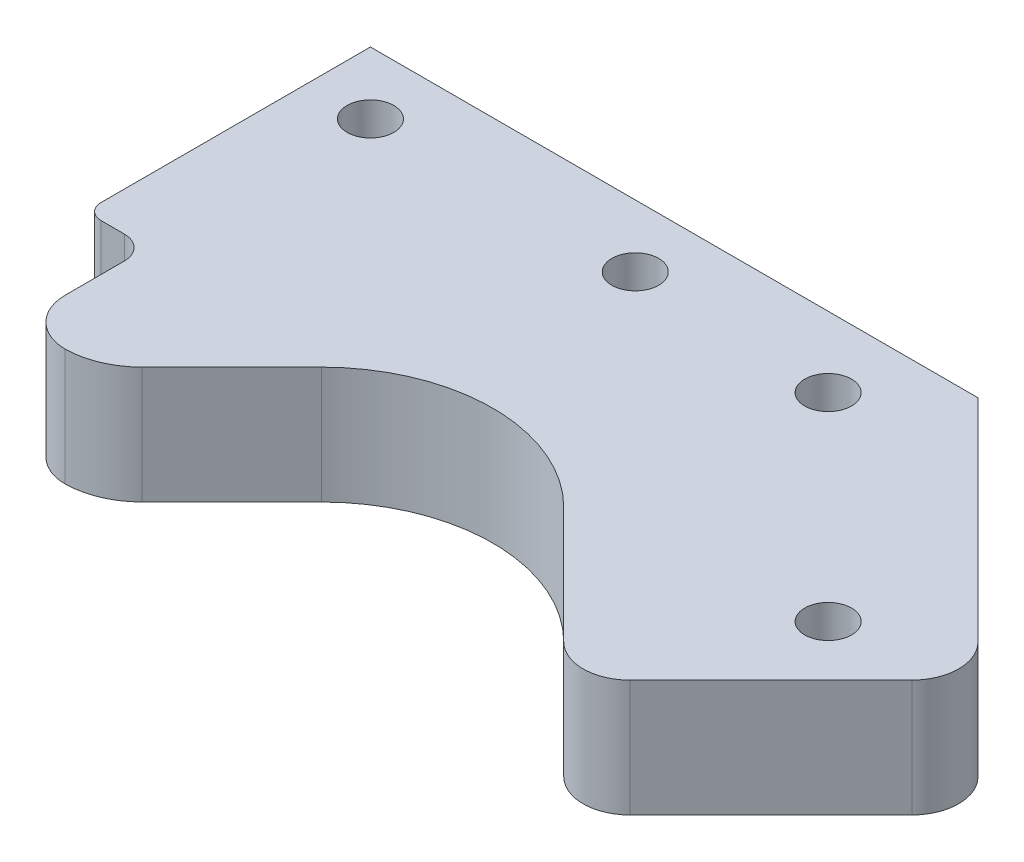
ISO-10303-21;
HEADER;
FILE_DESCRIPTION(('STEP AP214'),'2;1');
FILE_NAME('part.step','',(''),(''),'','','');
FILE_SCHEMA(('AUTOMOTIVE_DESIGN { 1 0 10303 214 1 1 1 1 }'));
ENDSEC;
DATA;
#1=APPLICATION_CONTEXT('core data for automotive mechanical design processes');
#2=APPLICATION_PROTOCOL_DEFINITION('international standard','automotive_design',2000,#1);
#3=PRODUCT_CONTEXT('',#1,'mechanical');
#4=PRODUCT('Part','Part','',(#3));
#5=PRODUCT_RELATED_PRODUCT_CATEGORY('part','',(#4));
#6=PRODUCT_DEFINITION_FORMATION('','',#4);
#7=PRODUCT_DEFINITION_CONTEXT('part definition',#1,'design');
#8=PRODUCT_DEFINITION('design','',#6,#7);
#9=PRODUCT_DEFINITION_SHAPE('','',#8);
#10=(LENGTH_UNIT() NAMED_UNIT(*) SI_UNIT(.MILLI.,.METRE.));
#11=(NAMED_UNIT(*) PLANE_ANGLE_UNIT() SI_UNIT($,.RADIAN.));
#12=(NAMED_UNIT(*) SI_UNIT($,.STERADIAN.) SOLID_ANGLE_UNIT());
#13=UNCERTAINTY_MEASURE_WITH_UNIT(LENGTH_MEASURE(1.E-05),#10,'distance_accuracy_value','');
#14=(GEOMETRIC_REPRESENTATION_CONTEXT(3) GLOBAL_UNCERTAINTY_ASSIGNED_CONTEXT((#13)) GLOBAL_UNIT_ASSIGNED_CONTEXT((#10,
#11,#12)) REPRESENTATION_CONTEXT('',''));
#15=CARTESIAN_POINT('',(0.,0.,0.));
#16=DIRECTION('',(0.,0.,1.));
#17=DIRECTION('',(1.,0.,0.));
#18=AXIS2_PLACEMENT_3D('',#15,#16,#17);
#19=CARTESIAN_POINT('',(-67.5733935335025,33.4967103874844,-7.65609227750308));
#20=DIRECTION('',(1.,0.,0.));
#21=DIRECTION('',(0.,1.,0.));
#22=AXIS2_PLACEMENT_3D('',#19,#20,#21);
#23=PLANE('',#22);
#24=DIRECTION('',(0.,0.,-1.));
#25=VECTOR('',#24,1.);
#26=CARTESIAN_POINT('',(-67.5733935335024,-2.50328961251562,10.639753178098));
#27=LINE('',#26,#25);
#28=CARTESIAN_POINT('',(-67.5733935335024,-2.50328961251562,9.63975317809799));
#29=VERTEX_POINT('',#28);
#30=CARTESIAN_POINT('',(-67.5733935344276,-2.50328961251562,2.34390772684515));
#31=VERTEX_POINT('',#30);
#32=EDGE_CURVE('E307',#29,#31,#27,.T.);
#33=ORIENTED_EDGE('',*,*,#32,.F.);
#34=DIRECTION('',(0.,-1.,0.));
#35=VECTOR('',#34,1.);
#36=CARTESIAN_POINT('',(-67.5733935335024,4.99671038748439,9.63975317809799));
#37=LINE('',#36,#35);
#38=CARTESIAN_POINT('',(-67.5733935335024,4.99671038748438,9.63975317809799));
#39=VERTEX_POINT('',#38);
#40=EDGE_CURVE('E43',#29,#39,#37,.F.);
#41=ORIENTED_EDGE('',*,*,#40,.T.);
#42=DIRECTION('',(0.,0.,-1.));
#43=VECTOR('',#42,1.);
#44=CARTESIAN_POINT('',(-67.5733935335024,4.99671038748438,10.639753178098));
#45=LINE('',#44,#43);
#46=CARTESIAN_POINT('',(-67.5733935335024,4.99671038748439,-7.65609227750308));
#47=VERTEX_POINT('',#46);
#48=EDGE_CURVE('E167',#39,#47,#45,.T.);
#49=ORIENTED_EDGE('',*,*,#48,.T.);
#50=DIRECTION('',(0.,-1.,0.));
#51=VECTOR('',#50,1.);
#52=CARTESIAN_POINT('',(-67.5733935335025,33.4967103874844,-7.65609227750308));
#53=LINE('',#52,#51);
#54=CARTESIAN_POINT('',(-67.5733935335024,0.496710387484396,-7.65609227750308));
#55=VERTEX_POINT('',#54);
#56=EDGE_CURVE('E171',#47,#55,#53,.T.);
#57=ORIENTED_EDGE('',*,*,#56,.T.);
#58=DIRECTION('',(0.,0.,-1.));
#59=VECTOR('',#58,1.);
#60=CARTESIAN_POINT('',(-67.5733935344276,0.496710387484384,2.34390772684515));
#61=LINE('',#60,#59);
#62=CARTESIAN_POINT('',(-67.5733935344276,0.496710387484384,2.34390772684515));
#63=VERTEX_POINT('',#62);
#64=EDGE_CURVE('E494',#63,#55,#61,.T.);
#65=ORIENTED_EDGE('',*,*,#64,.F.);
#66=DIRECTION('',(0.,-1.,0.));
#67=VECTOR('',#66,1.);
#68=CARTESIAN_POINT('',(-67.5733935344276,0.496710387484384,2.34390772684515));
#69=LINE('',#68,#67);
#70=EDGE_CURVE('E310',#63,#31,#69,.T.);
#71=ORIENTED_EDGE('',*,*,#70,.T.);
#72=EDGE_LOOP('',(#33,#41,#49,#57,#65,#71));
#73=FACE_BOUND('',#72,.T.);
#74=ADVANCED_FACE('F35',(#73),#23,.F.);
#75=CARTESIAN_POINT('',(-58.5722750187399,-2.50328961251561,-7.65609227750308));
#76=DIRECTION('',(0.,0.,1.));
#77=DIRECTION('',(1.,0.,0.));
#78=AXIS2_PLACEMENT_3D('',#75,#76,#77);
#79=PLANE('',#78);
#80=ORIENTED_EDGE('',*,*,#56,.F.);
#81=DIRECTION('',(-1.,0.,0.));
#82=VECTOR('',#81,1.);
#83=CARTESIAN_POINT('',(-28.5722488921053,4.99671038748443,-7.65609227750316));
#84=LINE('',#83,#82);
#85=CARTESIAN_POINT('',(-28.5722488921053,4.99671038748443,-7.65609227750316));
#86=VERTEX_POINT('',#85);
#87=EDGE_CURVE('E179',#86,#47,#84,.T.);
#88=ORIENTED_EDGE('',*,*,#87,.F.);
#89=DIRECTION('',(0.,1.,0.));
#90=VECTOR('',#89,1.);
#91=CARTESIAN_POINT('',(-28.5722488921053,-2.50328961251557,-7.65609227750316));
#92=LINE('',#91,#90);
#93=CARTESIAN_POINT('',(-28.5722488921053,-2.50328961251557,-7.65609227750316));
#94=VERTEX_POINT('',#93);
#95=EDGE_CURVE('E224',#94,#86,#92,.T.);
#96=ORIENTED_EDGE('',*,*,#95,.F.);
#97=DIRECTION('',(1.,0.,0.));
#98=VECTOR('',#97,1.);
#99=CARTESIAN_POINT('',(-58.5722750187399,-2.50328961251561,-7.65609227750308));
#100=LINE('',#99,#98);
#101=CARTESIAN_POINT('',(-39.5733935344276,-2.50328961251559,-7.65609227750313));
#102=VERTEX_POINT('',#101);
#103=EDGE_CURVE('E197',#102,#94,#100,.T.);
#104=ORIENTED_EDGE('',*,*,#103,.F.);
#105=DIRECTION('',(0.,-1.,0.));
#106=VECTOR('',#105,1.);
#107=CARTESIAN_POINT('',(-39.5733935344276,-2.50328961251559,-7.65609227750313));
#108=LINE('',#107,#106);
#109=CARTESIAN_POINT('',(-39.5733935344276,0.496710387484414,-7.65609227750307));
#110=VERTEX_POINT('',#109);
#111=EDGE_CURVE('E254',#102,#110,#108,.F.);
#112=ORIENTED_EDGE('',*,*,#111,.T.);
#113=DIRECTION('',(1.,0.,0.));
#114=VECTOR('',#113,1.);
#115=CARTESIAN_POINT('',(-67.5733935344276,0.496710387484384,-7.65609227750313));
#116=LINE('',#115,#114);
#117=EDGE_CURVE('E192',#55,#110,#116,.T.);
#118=ORIENTED_EDGE('',*,*,#117,.F.);
#119=EDGE_LOOP('',(#80,#88,#96,#104,#112,#118));
#120=FACE_BOUND('',#119,.T.);
#121=ADVANCED_FACE('F190',(#120),#79,.F.);
#122=CARTESIAN_POINT('',(-63.5733935335025,37.7393510746037,-3.65609227794905));
#123=DIRECTION('',(0.,-1.,0.));
#124=DIRECTION('',(1.,0.,0.));
#125=AXIS2_PLACEMENT_3D('',#122,#123,#124);
#126=CYLINDRICAL_SURFACE('',#125,1.5);
#127=CARTESIAN_POINT('',(-63.5733935335024,0.496710387484389,-3.65609227794905));
#128=DIRECTION('',(0.,-1.,0.));
#129=DIRECTION('',(1.,0.,0.));
#130=AXIS2_PLACEMENT_3D('',#127,#128,#129);
#131=CIRCLE('',#130,1.5);
#132=CARTESIAN_POINT('',(-62.0733935335024,0.496710387484391,-3.65609227794905));
#133=VERTEX_POINT('',#132);
#134=EDGE_CURVE('E508',#133,#133,#131,.T.);
#135=ORIENTED_EDGE('',*,*,#134,.T.);
#136=EDGE_LOOP('',(#135));
#137=FACE_BOUND('',#136,.T.);
#138=CARTESIAN_POINT('',(-63.5733935335024,4.99671038748439,-3.65609227794905));
#139=DIRECTION('',(0.,1.,0.));
#140=DIRECTION('',(-1.,0.,0.));
#141=AXIS2_PLACEMENT_3D('',#138,#139,#140);
#142=CIRCLE('',#141,1.5);
#143=CARTESIAN_POINT('',(-65.0733935335024,4.99671038748439,-3.65609227794905));
#144=VERTEX_POINT('',#143);
#145=EDGE_CURVE('E276',#144,#144,#142,.F.);
#146=ORIENTED_EDGE('',*,*,#145,.F.);
#147=EDGE_LOOP('',(#146));
#148=FACE_BOUND('',#147,.T.);
#149=ADVANCED_FACE('F352',(#137,#148),#126,.F.);
#150=CARTESIAN_POINT('',(-46.5733935343161,37.7393510746037,-3.65609227984443));
#151=DIRECTION('',(0.,-1.,0.));
#152=DIRECTION('',(1.,0.,0.));
#153=AXIS2_PLACEMENT_3D('',#150,#151,#152);
#154=CYLINDRICAL_SURFACE('',#153,1.5);
#155=CARTESIAN_POINT('',(-46.5733935343161,0.49671038748441,-3.65609227984443));
#156=DIRECTION('',(0.,-1.,0.));
#157=DIRECTION('',(1.,0.,0.));
#158=AXIS2_PLACEMENT_3D('',#155,#156,#157);
#159=CIRCLE('',#158,1.5);
#160=CARTESIAN_POINT('',(-45.0733935343161,0.496710387484412,-3.65609227984443));
#161=VERTEX_POINT('',#160);
#162=EDGE_CURVE('E500',#161,#161,#159,.T.);
#163=ORIENTED_EDGE('',*,*,#162,.T.);
#164=EDGE_LOOP('',(#163));
#165=FACE_BOUND('',#164,.T.);
#166=CARTESIAN_POINT('',(-46.5733935343161,4.99671038748441,-3.65609227984443));
#167=DIRECTION('',(0.,1.,0.));
#168=DIRECTION('',(-1.,0.,0.));
#169=AXIS2_PLACEMENT_3D('',#166,#167,#168);
#170=CIRCLE('',#169,1.5);
#171=CARTESIAN_POINT('',(-48.0733935343161,4.99671038748441,-3.65609227984443));
#172=VERTEX_POINT('',#171);
#173=EDGE_CURVE('E273',#172,#172,#170,.F.);
#174=ORIENTED_EDGE('',*,*,#173,.F.);
#175=EDGE_LOOP('',(#174));
#176=FACE_BOUND('',#175,.T.);
#177=ADVANCED_FACE('F350',(#165,#176),#154,.F.);
#178=CARTESIAN_POINT('',(-63.5722750187396,-2.50328961251561,18.9355986336991));
#179=DIRECTION('',(1.,0.,0.));
#180=DIRECTION('',(0.,1.,0.));
#181=AXIS2_PLACEMENT_3D('',#178,#179,#180);
#182=PLANE('',#181);
#183=DIRECTION('',(0.,-1.,0.));
#184=VECTOR('',#183,1.);
#185=CARTESIAN_POINT('',(-63.5722750187397,26.7428739990008,12.139753178098));
#186=LINE('',#185,#184);
#187=CARTESIAN_POINT('',(-63.5722750187396,4.99671038748439,12.139753178098));
#188=VERTEX_POINT('',#187);
#189=CARTESIAN_POINT('',(-63.5722750187396,-2.50328961251561,12.139753178098));
#190=VERTEX_POINT('',#189);
#191=EDGE_CURVE('E302',#188,#190,#186,.T.);
#192=ORIENTED_EDGE('',*,*,#191,.T.);
#193=DIRECTION('',(0.,0.,-1.));
#194=VECTOR('',#193,1.);
#195=CARTESIAN_POINT('',(-63.5722750187396,-2.50328961251561,18.9355986336991));
#196=LINE('',#195,#194);
#197=CARTESIAN_POINT('',(-63.5722750187396,-2.50328961251561,15.9355986336993));
#198=VERTEX_POINT('',#197);
#199=EDGE_CURVE('E193',#198,#190,#196,.T.);
#200=ORIENTED_EDGE('',*,*,#199,.F.);
#201=DIRECTION('',(0.,1.,0.));
#202=VECTOR('',#201,1.);
#203=CARTESIAN_POINT('',(-63.5722750187396,-2.50328961251561,15.9355986336993));
#204=LINE('',#203,#202);
#205=CARTESIAN_POINT('',(-63.5722750187396,4.99671038748439,15.9355986336993));
#206=VERTEX_POINT('',#205);
#207=EDGE_CURVE('E226',#198,#206,#204,.T.);
#208=ORIENTED_EDGE('',*,*,#207,.T.);
#209=DIRECTION('',(0.,0.,1.));
#210=VECTOR('',#209,1.);
#211=CARTESIAN_POINT('',(-63.5722750187396,4.99671038748439,12.139753178098));
#212=LINE('',#211,#210);
#213=EDGE_CURVE('E187',#188,#206,#212,.T.);
#214=ORIENTED_EDGE('',*,*,#213,.F.);
#215=EDGE_LOOP('',(#192,#200,#208,#214));
#216=FACE_BOUND('',#215,.T.);
#217=ADVANCED_FACE('F341',(#216),#182,.F.);
#218=CARTESIAN_POINT('',(-60.5722750187396,4.99671038748439,15.9355986336993));
#219=DIRECTION('',(0.,1.,0.));
#220=DIRECTION('',(-1.,0.,0.));
#221=AXIS2_PLACEMENT_3D('',#218,#219,#220);
#222=PLANE('',#221);
#223=ORIENTED_EDGE('',*,*,#48,.F.);
#224=CARTESIAN_POINT('',(-66.5733935335024,4.99671038748439,9.63975317809799));
#225=DIRECTION('',(0.,1.,0.));
#226=DIRECTION('',(-1.,0.,0.));
#227=AXIS2_PLACEMENT_3D('',#224,#225,#226);
#228=CIRCLE('',#227,1.);
#229=CARTESIAN_POINT('',(-66.5733935335024,4.99671038748439,10.639753178098));
#230=VERTEX_POINT('',#229);
#231=EDGE_CURVE('E11',#39,#230,#228,.T.);
#232=ORIENTED_EDGE('',*,*,#231,.T.);
#233=DIRECTION('',(-1.,0.,0.));
#234=VECTOR('',#233,1.);
#235=CARTESIAN_POINT('',(-65.0722750187396,4.99671038748439,10.639753178098));
#236=LINE('',#235,#234);
#237=CARTESIAN_POINT('',(-65.0722750187397,4.99671038748439,10.639753178098));
#238=VERTEX_POINT('',#237);
#239=EDGE_CURVE('E176',#238,#230,#236,.T.);
#240=ORIENTED_EDGE('',*,*,#239,.F.);
#241=CARTESIAN_POINT('',(-65.0722750187396,4.99671038748439,12.139753178098));
#242=DIRECTION('',(0.,1.,0.));
#243=DIRECTION('',(-1.,0.,0.));
#244=AXIS2_PLACEMENT_3D('',#241,#242,#243);
#245=CIRCLE('',#244,1.5);
#246=EDGE_CURVE('E305',#188,#238,#245,.T.);
#247=ORIENTED_EDGE('',*,*,#246,.F.);
#248=ORIENTED_EDGE('',*,*,#213,.T.);
#249=CARTESIAN_POINT('',(-60.5722750187396,4.99671038748439,15.9355986336993));
#250=DIRECTION('',(0.,1.,0.));
#251=DIRECTION('',(-1.,0.,0.));
#252=AXIS2_PLACEMENT_3D('',#249,#250,#251);
#253=CIRCLE('',#252,3.00000000000001);
#254=CARTESIAN_POINT('',(-60.5722750187398,4.99671038748439,18.9355986336993));
#255=VERTEX_POINT('',#254);
#256=EDGE_CURVE('E175',#206,#255,#253,.T.);
#257=ORIENTED_EDGE('',*,*,#256,.T.);
#258=CARTESIAN_POINT('',(-60.6438552295181,4.99671038748439,13.9361110326121));
#259=DIRECTION('',(0.,1.,0.));
#260=DIRECTION('',(-1.,0.,0.));
#261=AXIS2_PLACEMENT_3D('',#258,#259,#260);
#262=CIRCLE('',#261,5.);
#263=CARTESIAN_POINT('',(-57.1083213235853,4.9967103874844,17.4716449385448));
#264=VERTEX_POINT('',#263);
#265=EDGE_CURVE('E248',#255,#264,#262,.T.);
#266=ORIENTED_EDGE('',*,*,#265,.T.);
#267=DIRECTION('',(0.707106781186544,0.,-0.707106781186551));
#268=VECTOR('',#267,1.);
#269=CARTESIAN_POINT('',(-58.5722750187399,4.99671038748439,18.9355986336994));
#270=LINE('',#269,#268);
#271=CARTESIAN_POINT('',(-51.350423485157,4.9967103874844,11.7137471001164));
#272=VERTEX_POINT('',#271);
#273=EDGE_CURVE('E321',#264,#272,#270,.T.);
#274=ORIENTED_EDGE('',*,*,#273,.T.);
#275=CARTESIAN_POINT('',(-43.572248892105,4.99671038748441,19.4919216931684));
#276=DIRECTION('',(0.,-1.,0.));
#277=DIRECTION('',(-1.,0.,0.));
#278=AXIS2_PLACEMENT_3D('',#275,#276,#277);
#279=CIRCLE('',#278,11.);
#280=CARTESIAN_POINT('',(-35.794074299053,4.99671038748442,11.7137471001164));
#281=VERTEX_POINT('',#280);
#282=EDGE_CURVE('E323',#272,#281,#279,.T.);
#283=ORIENTED_EDGE('',*,*,#282,.T.);
#284=DIRECTION('',(0.707106781186552,0.,0.707106781186543));
#285=VECTOR('',#284,1.);
#286=CARTESIAN_POINT('',(-35.794074299053,4.99671038748442,11.7137471001164));
#287=LINE('',#286,#285);
#288=CARTESIAN_POINT('',(-28.2938559915835,4.99671038748443,19.2139654075857));
#289=VERTEX_POINT('',#288);
#290=EDGE_CURVE('E325',#281,#289,#287,.T.);
#291=ORIENTED_EDGE('',*,*,#290,.T.);
#292=CARTESIAN_POINT('',(-26.1725356480239,4.99671038748443,17.0926450640261));
#293=DIRECTION('',(0.,1.,0.));
#294=DIRECTION('',(-1.,0.,0.));
#295=AXIS2_PLACEMENT_3D('',#292,#293,#294);
#296=CIRCLE('',#295,3.);
#297=CARTESIAN_POINT('',(-24.0512153044643,4.99671038748443,19.2139654075857));
#298=VERTEX_POINT('',#297);
#299=EDGE_CURVE('E327',#289,#298,#296,.T.);
#300=ORIENTED_EDGE('',*,*,#299,.T.);
#301=DIRECTION('',(0.707106781186548,0.,-0.707106781186547));
#302=VECTOR('',#301,1.);
#303=CARTESIAN_POINT('',(-24.0512153044643,4.99671038748443,19.2139654075857));
#304=LINE('',#303,#302);
#305=CARTESIAN_POINT('',(-14.9980235993,4.99671038748443,10.1607737024214));
#306=VERTEX_POINT('',#305);
#307=EDGE_CURVE('E329',#298,#306,#304,.T.);
#308=ORIENTED_EDGE('',*,*,#307,.T.);
#309=CARTESIAN_POINT('',(-17.1193439428596,4.99671038748444,8.03945335886178));
#310=DIRECTION('',(0.,1.,0.));
#311=DIRECTION('',(-1.,0.,0.));
#312=AXIS2_PLACEMENT_3D('',#309,#310,#311);
#313=CIRCLE('',#312,3.);
#314=CARTESIAN_POINT('',(-14.9980235993,4.99671038748444,5.91813301530214));
#315=VERTEX_POINT('',#314);
#316=EDGE_CURVE('E331',#306,#315,#313,.T.);
#317=ORIENTED_EDGE('',*,*,#316,.T.);
#318=DIRECTION('',(-0.707106781186547,0.,-0.707106781186548));
#319=VECTOR('',#318,1.);
#320=CARTESIAN_POINT('',(-14.9980235993,4.99671038748444,5.91813301530214));
#321=LINE('',#320,#319);
#322=EDGE_CURVE('E183',#315,#86,#321,.T.);
#323=ORIENTED_EDGE('',*,*,#322,.T.);
#324=ORIENTED_EDGE('',*,*,#87,.T.);
#325=EDGE_LOOP('',(#223,#232,#240,#247,#248,#257,#266,#274,#283,#291,#300,#308,#317,#323,#324));
#326=FACE_BOUND('',#325,.T.);
#327=CARTESIAN_POINT('',(-20.9448318941352,4.99671038748443,9.59242675655713));
#328=DIRECTION('',(0.,1.,0.));
#329=DIRECTION('',(-1.,0.,0.));
#330=AXIS2_PLACEMENT_3D('',#327,#328,#329);
#331=CIRCLE('',#330,1.5);
#332=CARTESIAN_POINT('',(-22.4448318941352,4.99671038748443,9.59242675655713));
#333=VERTEX_POINT('',#332);
#334=EDGE_CURVE('E200',#333,#333,#331,.T.);
#335=ORIENTED_EDGE('',*,*,#334,.F.);
#336=EDGE_LOOP('',(#335));
#337=FACE_BOUND('',#336,.T.);
#338=CARTESIAN_POINT('',(-33.6727539554929,4.99671038748442,-3.13549530480089));
#339=DIRECTION('',(0.,1.,0.));
#340=DIRECTION('',(-1.,0.,0.));
#341=AXIS2_PLACEMENT_3D('',#338,#339,#340);
#342=CIRCLE('',#341,1.5);
#343=CARTESIAN_POINT('',(-35.1727539554929,4.99671038748442,-3.13549530480089));
#344=VERTEX_POINT('',#343);
#345=EDGE_CURVE('E194',#344,#344,#342,.T.);
#346=ORIENTED_EDGE('',*,*,#345,.F.);
#347=EDGE_LOOP('',(#346));
#348=FACE_BOUND('',#347,.T.);
#349=ORIENTED_EDGE('',*,*,#145,.T.);
#350=EDGE_LOOP('',(#349));
#351=FACE_BOUND('',#350,.T.);
#352=ORIENTED_EDGE('',*,*,#173,.T.);
#353=EDGE_LOOP('',(#352));
#354=FACE_BOUND('',#353,.T.);
#355=ADVANCED_FACE('F180',(#326,#337,#348,#351,#354),#222,.T.);
#356=CARTESIAN_POINT('',(-28.5722488921053,-2.50328961251557,-7.65609227750316));
#357=DIRECTION('',(-0.707106781186548,0.,0.707106781186547));
#358=DIRECTION('',(0.707106781186547,0.,0.707106781186548));
#359=AXIS2_PLACEMENT_3D('',#356,#357,#358);
#360=PLANE('',#359);
#361=ORIENTED_EDGE('',*,*,#322,.F.);
#362=DIRECTION('',(0.,1.,0.));
#363=VECTOR('',#362,1.);
#364=CARTESIAN_POINT('',(-14.9980235993,-2.50328961251556,5.91813301530214));
#365=LINE('',#364,#363);
#366=CARTESIAN_POINT('',(-14.9980235993,-2.50328961251556,5.91813301530214));
#367=VERTEX_POINT('',#366);
#368=EDGE_CURVE('E246',#315,#367,#365,.F.);
#369=ORIENTED_EDGE('',*,*,#368,.T.);
#370=DIRECTION('',(0.707106781186547,0.,0.707106781186548));
#371=VECTOR('',#370,1.);
#372=CARTESIAN_POINT('',(-28.5722488921053,-2.50328961251557,-7.65609227750316));
#373=LINE('',#372,#371);
#374=EDGE_CURVE('E205',#94,#367,#373,.T.);
#375=ORIENTED_EDGE('',*,*,#374,.F.);
#376=ORIENTED_EDGE('',*,*,#95,.T.);
#377=EDGE_LOOP('',(#361,#369,#375,#376));
#378=FACE_BOUND('',#377,.T.);
#379=ADVANCED_FACE('F340',(#378),#360,.F.);
#380=CARTESIAN_POINT('',(-26.1725356480239,-2.50328961251557,21.3352857511453));
#381=DIRECTION('',(-0.707106781186547,0.,-0.707106781186548));
#382=DIRECTION('',(-0.707106781186548,0.,0.707106781186547));
#383=AXIS2_PLACEMENT_3D('',#380,#381,#382);
#384=PLANE('',#383);
#385=ORIENTED_EDGE('',*,*,#307,.F.);
#386=DIRECTION('',(0.,1.,0.));
#387=VECTOR('',#386,1.);
#388=CARTESIAN_POINT('',(-24.0512153044643,-2.50328961251557,19.2139654075857));
#389=LINE('',#388,#387);
#390=CARTESIAN_POINT('',(-24.0512153044643,-2.50328961251557,19.2139654075857));
#391=VERTEX_POINT('',#390);
#392=EDGE_CURVE('E244',#298,#391,#389,.F.);
#393=ORIENTED_EDGE('',*,*,#392,.T.);
#394=DIRECTION('',(-0.707106781186548,0.,0.707106781186547));
#395=VECTOR('',#394,1.);
#396=CARTESIAN_POINT('',(-26.1725356480239,-2.50328961251557,21.3352857511453));
#397=LINE('',#396,#395);
#398=CARTESIAN_POINT('',(-14.9980235993,-2.50328961251556,10.1607737024214));
#399=VERTEX_POINT('',#398);
#400=EDGE_CURVE('E208',#399,#391,#397,.T.);
#401=ORIENTED_EDGE('',*,*,#400,.F.);
#402=DIRECTION('',(0.,1.,0.));
#403=VECTOR('',#402,1.);
#404=CARTESIAN_POINT('',(-14.9980235993,-2.50328961251556,10.1607737024214));
#405=LINE('',#404,#403);
#406=EDGE_CURVE('E241',#399,#306,#405,.T.);
#407=ORIENTED_EDGE('',*,*,#406,.T.);
#408=EDGE_LOOP('',(#385,#393,#401,#407));
#409=FACE_BOUND('',#408,.T.);
#410=ADVANCED_FACE('F397',(#409),#384,.F.);
#411=CARTESIAN_POINT('',(-35.7940742990529,-2.50328961251558,11.7137471001163));
#412=DIRECTION('',(0.707106781186547,0.,-0.707106781186549));
#413=DIRECTION('',(-0.707106781186549,0.,-0.707106781186547));
#414=AXIS2_PLACEMENT_3D('',#411,#412,#413);
#415=PLANE('',#414);
#416=ORIENTED_EDGE('',*,*,#290,.F.);
#417=DIRECTION('',(0.,1.,0.));
#418=VECTOR('',#417,1.);
#419=CARTESIAN_POINT('',(-35.7940742990529,-2.50328961251558,11.7137471001164));
#420=LINE('',#419,#418);
#421=CARTESIAN_POINT('',(-35.7940742990529,-2.50328961251558,11.7137471001164));
#422=VERTEX_POINT('',#421);
#423=EDGE_CURVE('E221',#422,#281,#420,.T.);
#424=ORIENTED_EDGE('',*,*,#423,.F.);
#425=DIRECTION('',(-0.707106781186548,0.,-0.707106781186547));
#426=VECTOR('',#425,1.);
#427=CARTESIAN_POINT('',(-35.7940742990529,-2.50328961251558,11.7137471001163));
#428=LINE('',#427,#426);
#429=CARTESIAN_POINT('',(-28.2938559915835,-2.50328961251557,19.2139654075857));
#430=VERTEX_POINT('',#429);
#431=EDGE_CURVE('E211',#430,#422,#428,.T.);
#432=ORIENTED_EDGE('',*,*,#431,.F.);
#433=DIRECTION('',(0.,1.,0.));
#434=VECTOR('',#433,1.);
#435=CARTESIAN_POINT('',(-28.2938559915835,-2.50328961251557,19.2139654075857));
#436=LINE('',#435,#434);
#437=EDGE_CURVE('E238',#430,#289,#436,.T.);
#438=ORIENTED_EDGE('',*,*,#437,.T.);
#439=EDGE_LOOP('',(#416,#424,#432,#438));
#440=FACE_BOUND('',#439,.T.);
#441=ADVANCED_FACE('F393',(#440),#415,.F.);
#442=CARTESIAN_POINT('',(-43.572248892105,-2.50328961251559,19.4919216931684));
#443=DIRECTION('',(0.,1.,0.));
#444=DIRECTION('',(-1.,0.,0.));
#445=AXIS2_PLACEMENT_3D('',#442,#443,#444);
#446=CYLINDRICAL_SURFACE('',#445,11.);
#447=ORIENTED_EDGE('',*,*,#282,.F.);
#448=DIRECTION('',(0.,1.,0.));
#449=VECTOR('',#448,1.);
#450=CARTESIAN_POINT('',(-51.350423485157,-2.5032896125156,11.7137471001164));
#451=LINE('',#450,#449);
#452=CARTESIAN_POINT('',(-51.350423485157,-2.5032896125156,11.7137471001164));
#453=VERTEX_POINT('',#452);
#454=EDGE_CURVE('E218',#453,#272,#451,.T.);
#455=ORIENTED_EDGE('',*,*,#454,.F.);
#456=CARTESIAN_POINT('',(-43.572248892105,-2.50328961251559,19.4919216931684));
#457=DIRECTION('',(0.,1.,0.));
#458=DIRECTION('',(1.,0.,0.));
#459=AXIS2_PLACEMENT_3D('',#456,#457,#458);
#460=CIRCLE('',#459,11.);
#461=EDGE_CURVE('E213',#422,#453,#460,.T.);
#462=ORIENTED_EDGE('',*,*,#461,.F.);
#463=ORIENTED_EDGE('',*,*,#423,.T.);
#464=EDGE_LOOP('',(#447,#455,#462,#463));
#465=FACE_BOUND('',#464,.T.);
#466=ADVANCED_FACE('F389',(#465),#446,.F.);
#467=CARTESIAN_POINT('',(-58.5722750187399,-2.50328961251561,18.9355986336994));
#468=DIRECTION('',(-0.707106781186551,0.,-0.707106781186544));
#469=DIRECTION('',(-0.707106781186544,0.,0.707106781186551));
#470=AXIS2_PLACEMENT_3D('',#467,#468,#469);
#471=PLANE('',#470);
#472=ORIENTED_EDGE('',*,*,#273,.F.);
#473=DIRECTION('',(0.,1.,0.));
#474=VECTOR('',#473,1.);
#475=CARTESIAN_POINT('',(-57.1083213235853,-2.5032896125156,17.4716449385448));
#476=LINE('',#475,#474);
#477=CARTESIAN_POINT('',(-57.1083213235853,-2.5032896125156,17.4716449385448));
#478=VERTEX_POINT('',#477);
#479=EDGE_CURVE('E250',#264,#478,#476,.F.);
#480=ORIENTED_EDGE('',*,*,#479,.T.);
#481=DIRECTION('',(-0.707106781186544,0.,0.707106781186551));
#482=VECTOR('',#481,1.);
#483=CARTESIAN_POINT('',(-58.5722750187399,-2.50328961251561,18.9355986336994));
#484=LINE('',#483,#482);
#485=EDGE_CURVE('E215',#453,#478,#484,.T.);
#486=ORIENTED_EDGE('',*,*,#485,.F.);
#487=ORIENTED_EDGE('',*,*,#454,.T.);
#488=EDGE_LOOP('',(#472,#480,#486,#487));
#489=FACE_BOUND('',#488,.T.);
#490=ADVANCED_FACE('F380',(#489),#471,.F.);
#491=CARTESIAN_POINT('',(-33.6727539554929,-2.50328961251558,-3.13549530480089));
#492=DIRECTION('',(0.,1.,0.));
#493=DIRECTION('',(-1.,0.,0.));
#494=AXIS2_PLACEMENT_3D('',#491,#492,#493);
#495=CYLINDRICAL_SURFACE('',#494,1.5);
#496=CARTESIAN_POINT('',(-33.6727539554929,-1.00328961251558,-3.13549530480089));
#497=DIRECTION('',(0.,-1.,0.));
#498=DIRECTION('',(0.,0.,-1.));
#499=AXIS2_PLACEMENT_3D('',#496,#497,#498);
#500=CIRCLE('',#499,1.5);
#501=CARTESIAN_POINT('',(-33.6727539554929,-1.00328961251558,-4.6354953048009));
#502=VERTEX_POINT('',#501);
#503=EDGE_CURVE('E272',#502,#502,#500,.T.);
#504=ORIENTED_EDGE('',*,*,#503,.T.);
#505=EDGE_LOOP('',(#504));
#506=FACE_BOUND('',#505,.T.);
#507=ORIENTED_EDGE('',*,*,#345,.T.);
#508=EDGE_LOOP('',(#507));
#509=FACE_BOUND('',#508,.T.);
#510=ADVANCED_FACE('F376',(#506,#509),#495,.F.);
#511=CARTESIAN_POINT('',(-20.9448318941352,-2.50328961251557,9.59242675655713));
#512=DIRECTION('',(0.,1.,0.));
#513=DIRECTION('',(-1.,0.,0.));
#514=AXIS2_PLACEMENT_3D('',#511,#512,#513);
#515=CYLINDRICAL_SURFACE('',#514,1.5);
#516=CARTESIAN_POINT('',(-20.9448318941352,-1.00328961251558,9.59242675655713));
#517=DIRECTION('',(0.,-1.,0.));
#518=DIRECTION('',(0.,0.,-1.));
#519=AXIS2_PLACEMENT_3D('',#516,#517,#518);
#520=CIRCLE('',#519,1.5);
#521=CARTESIAN_POINT('',(-20.9448318941352,-1.00328961251558,8.09242675655713));
#522=VERTEX_POINT('',#521);
#523=EDGE_CURVE('E285',#522,#522,#520,.T.);
#524=ORIENTED_EDGE('',*,*,#523,.T.);
#525=EDGE_LOOP('',(#524));
#526=FACE_BOUND('',#525,.T.);
#527=ORIENTED_EDGE('',*,*,#334,.T.);
#528=EDGE_LOOP('',(#527));
#529=FACE_BOUND('',#528,.T.);
#530=ADVANCED_FACE('F337',(#526,#529),#515,.F.);
#531=CARTESIAN_POINT('',(-60.5722750187396,-2.50328961251561,15.9355986336993));
#532=DIRECTION('',(0.,1.,0.));
#533=DIRECTION('',(-1.,0.,0.));
#534=AXIS2_PLACEMENT_3D('',#531,#532,#533);
#535=CYLINDRICAL_SURFACE('',#534,3.);
#536=DIRECTION('',(0.,1.,0.));
#537=VECTOR('',#536,1.);
#538=CARTESIAN_POINT('',(-60.5722750187398,-2.50328961251561,18.9355986336993));
#539=LINE('',#538,#537);
#540=CARTESIAN_POINT('',(-60.5722750187398,-2.50328961251561,18.9355986336993));
#541=VERTEX_POINT('',#540);
#542=EDGE_CURVE('E229',#255,#541,#539,.F.);
#543=ORIENTED_EDGE('',*,*,#542,.F.);
#544=ORIENTED_EDGE('',*,*,#256,.F.);
#545=ORIENTED_EDGE('',*,*,#207,.F.);
#546=CARTESIAN_POINT('',(-60.5722750187396,-2.50328961251561,15.9355986336993));
#547=DIRECTION('',(0.,-1.,0.));
#548=DIRECTION('',(1.,0.,0.));
#549=AXIS2_PLACEMENT_3D('',#546,#547,#548);
#550=CIRCLE('',#549,3.);
#551=EDGE_CURVE('E236',#541,#198,#550,.T.);
#552=ORIENTED_EDGE('',*,*,#551,.F.);
#553=EDGE_LOOP('',(#543,#544,#545,#552));
#554=FACE_BOUND('',#553,.T.);
#555=ADVANCED_FACE('F375',(#554),#535,.T.);
#556=CARTESIAN_POINT('',(-26.1725356480239,-2.50328961251557,17.0926450640261));
#557=DIRECTION('',(0.,1.,0.));
#558=DIRECTION('',(-1.,0.,0.));
#559=AXIS2_PLACEMENT_3D('',#556,#557,#558);
#560=CYLINDRICAL_SURFACE('',#559,3.);
#561=ORIENTED_EDGE('',*,*,#392,.F.);
#562=ORIENTED_EDGE('',*,*,#299,.F.);
#563=ORIENTED_EDGE('',*,*,#437,.F.);
#564=CARTESIAN_POINT('',(-26.1725356480239,-2.50328961251557,17.0926450640261));
#565=DIRECTION('',(0.,-1.,0.));
#566=DIRECTION('',(1.,0.,0.));
#567=AXIS2_PLACEMENT_3D('',#564,#565,#566);
#568=CIRCLE('',#567,3.);
#569=EDGE_CURVE('E234',#391,#430,#568,.T.);
#570=ORIENTED_EDGE('',*,*,#569,.F.);
#571=EDGE_LOOP('',(#561,#562,#563,#570));
#572=FACE_BOUND('',#571,.T.);
#573=ADVANCED_FACE('F407',(#572),#560,.T.);
#574=CARTESIAN_POINT('',(-17.1193439428596,-2.50328961251556,8.03945335886178));
#575=DIRECTION('',(0.,1.,0.));
#576=DIRECTION('',(-1.,0.,0.));
#577=AXIS2_PLACEMENT_3D('',#574,#575,#576);
#578=CYLINDRICAL_SURFACE('',#577,3.);
#579=ORIENTED_EDGE('',*,*,#368,.F.);
#580=ORIENTED_EDGE('',*,*,#316,.F.);
#581=ORIENTED_EDGE('',*,*,#406,.F.);
#582=CARTESIAN_POINT('',(-17.1193439428596,-2.50328961251556,8.03945335886178));
#583=DIRECTION('',(0.,-1.,0.));
#584=DIRECTION('',(1.,0.,0.));
#585=AXIS2_PLACEMENT_3D('',#582,#583,#584);
#586=CIRCLE('',#585,3.);
#587=EDGE_CURVE('E232',#367,#399,#586,.T.);
#588=ORIENTED_EDGE('',*,*,#587,.F.);
#589=EDGE_LOOP('',(#579,#580,#581,#588));
#590=FACE_BOUND('',#589,.T.);
#591=ADVANCED_FACE('F385',(#590),#578,.T.);
#592=CARTESIAN_POINT('',(-43.572248892105,-2.50328961251559,19.4919216931684));
#593=DIRECTION('',(0.,-1.,0.));
#594=DIRECTION('',(1.,0.,0.));
#595=AXIS2_PLACEMENT_3D('',#592,#593,#594);
#596=PLANE('',#595);
#597=CARTESIAN_POINT('',(-33.6727539554929,-2.50328961251558,-3.13549530480089));
#598=DIRECTION('',(0.,-1.,0.));
#599=DIRECTION('',(1.,0.,0.));
#600=AXIS2_PLACEMENT_3D('',#597,#598,#599);
#601=CIRCLE('',#600,3.00000000000001);
#602=CARTESIAN_POINT('',(-30.6727539554929,-2.50328961251558,-3.13549530480089));
#603=VERTEX_POINT('',#602);
#604=EDGE_CURVE('E282',#603,#603,#601,.F.);
#605=ORIENTED_EDGE('',*,*,#604,.T.);
#606=EDGE_LOOP('',(#605));
#607=FACE_BOUND('',#606,.T.);
#608=CARTESIAN_POINT('',(-20.9448318941352,-2.50328961251557,9.59242675655713));
#609=DIRECTION('',(0.,-1.,0.));
#610=DIRECTION('',(1.,0.,0.));
#611=AXIS2_PLACEMENT_3D('',#608,#609,#610);
#612=CIRCLE('',#611,2.99999999999998);
#613=CARTESIAN_POINT('',(-17.9448318941353,-2.50328961251556,9.59242675655713));
#614=VERTEX_POINT('',#613);
#615=EDGE_CURVE('E279',#614,#614,#612,.F.);
#616=ORIENTED_EDGE('',*,*,#615,.T.);
#617=EDGE_LOOP('',(#616));
#618=FACE_BOUND('',#617,.T.);
#619=DIRECTION('',(-1.,0.,0.));
#620=VECTOR('',#619,1.);
#621=CARTESIAN_POINT('',(-65.0722750187396,-2.50328961251561,10.639753178098));
#622=LINE('',#621,#620);
#623=CARTESIAN_POINT('',(-65.0722750187396,-2.50328961251561,10.639753178098));
#624=VERTEX_POINT('',#623);
#625=CARTESIAN_POINT('',(-66.5733935335024,-2.50328961251561,10.639753178098));
#626=VERTEX_POINT('',#625);
#627=EDGE_CURVE('E297',#624,#626,#622,.T.);
#628=ORIENTED_EDGE('',*,*,#627,.T.);
#629=CARTESIAN_POINT('',(-66.5733935335024,-2.50328961251561,9.63975317809799));
#630=DIRECTION('',(0.,-1.,0.));
#631=DIRECTION('',(1.,0.,0.));
#632=AXIS2_PLACEMENT_3D('',#629,#630,#631);
#633=CIRCLE('',#632,1.);
#634=EDGE_CURVE('E57',#626,#29,#633,.T.);
#635=ORIENTED_EDGE('',*,*,#634,.T.);
#636=ORIENTED_EDGE('',*,*,#32,.T.);
#637=DIRECTION('',(-1.,0.,0.));
#638=VECTOR('',#637,1.);
#639=CARTESIAN_POINT('',(-67.5733935344276,-2.50328961251562,2.34390772684515));
#640=LINE('',#639,#638);
#641=CARTESIAN_POINT('',(-45.5733935344276,-2.50328961251559,2.34390772684515));
#642=VERTEX_POINT('',#641);
#643=EDGE_CURVE('E499',#642,#31,#640,.T.);
#644=ORIENTED_EDGE('',*,*,#643,.F.);
#645=CARTESIAN_POINT('',(-45.5733935344276,-2.50328961251559,-0.656092273154854));
#646=DIRECTION('',(0.,-1.,0.));
#647=DIRECTION('',(1.,0.,0.));
#648=AXIS2_PLACEMENT_3D('',#645,#646,#647);
#649=CIRCLE('',#648,3.);
#650=CARTESIAN_POINT('',(-42.5733935344276,-2.50328961251559,-0.656092273154854));
#651=VERTEX_POINT('',#650);
#652=EDGE_CURVE('E268',#642,#651,#649,.F.);
#653=ORIENTED_EDGE('',*,*,#652,.T.);
#654=DIRECTION('',(0.,0.,1.));
#655=VECTOR('',#654,1.);
#656=CARTESIAN_POINT('',(-42.5733935344276,-2.50328961251559,2.34390772684515));
#657=LINE('',#656,#655);
#658=CARTESIAN_POINT('',(-42.5733935344276,-2.50328961251559,-4.65609227750313));
#659=VERTEX_POINT('',#658);
#660=EDGE_CURVE('E498',#659,#651,#657,.T.);
#661=ORIENTED_EDGE('',*,*,#660,.F.);
#662=CARTESIAN_POINT('',(-39.5733935344276,-2.50328961251559,-4.65609227750313));
#663=DIRECTION('',(0.,-1.,0.));
#664=DIRECTION('',(1.,0.,0.));
#665=AXIS2_PLACEMENT_3D('',#662,#663,#664);
#666=CIRCLE('',#665,3.);
#667=EDGE_CURVE('E266',#659,#102,#666,.T.);
#668=ORIENTED_EDGE('',*,*,#667,.T.);
#669=ORIENTED_EDGE('',*,*,#103,.T.);
#670=ORIENTED_EDGE('',*,*,#374,.T.);
#671=ORIENTED_EDGE('',*,*,#587,.T.);
#672=ORIENTED_EDGE('',*,*,#400,.T.);
#673=ORIENTED_EDGE('',*,*,#569,.T.);
#674=ORIENTED_EDGE('',*,*,#431,.T.);
#675=ORIENTED_EDGE('',*,*,#461,.T.);
#676=ORIENTED_EDGE('',*,*,#485,.T.);
#677=CARTESIAN_POINT('',(-60.6438552295181,-2.50328961251561,13.9361110326121));
#678=DIRECTION('',(0.,-1.,0.));
#679=DIRECTION('',(1.,0.,0.));
#680=AXIS2_PLACEMENT_3D('',#677,#678,#679);
#681=CIRCLE('',#680,5.);
#682=EDGE_CURVE('E252',#478,#541,#681,.T.);
#683=ORIENTED_EDGE('',*,*,#682,.T.);
#684=ORIENTED_EDGE('',*,*,#551,.T.);
#685=ORIENTED_EDGE('',*,*,#199,.T.);
#686=CARTESIAN_POINT('',(-65.0722750187396,-2.50328961251561,12.139753178098));
#687=DIRECTION('',(0.,1.,0.));
#688=DIRECTION('',(1.,0.,0.));
#689=AXIS2_PLACEMENT_3D('',#686,#687,#688);
#690=CIRCLE('',#689,1.5);
#691=EDGE_CURVE('E301',#190,#624,#690,.T.);
#692=ORIENTED_EDGE('',*,*,#691,.T.);
#693=EDGE_LOOP('',(#628,#635,#636,#644,#653,#661,#668,#669,#670,#671,#672,#673,#674,#675,#676,
#683,#684,#685,#692));
#694=FACE_BOUND('',#693,.T.);
#695=ADVANCED_FACE('F300',(#607,#618,#694),#596,.T.);
#696=CARTESIAN_POINT('',(-60.6438552295181,-2.50328961251561,13.9361110326121));
#697=DIRECTION('',(0.,1.,0.));
#698=DIRECTION('',(-1.,0.,0.));
#699=AXIS2_PLACEMENT_3D('',#696,#697,#698);
#700=CYLINDRICAL_SURFACE('',#699,5.);
#701=ORIENTED_EDGE('',*,*,#682,.F.);
#702=ORIENTED_EDGE('',*,*,#479,.F.);
#703=ORIENTED_EDGE('',*,*,#265,.F.);
#704=ORIENTED_EDGE('',*,*,#542,.T.);
#705=EDGE_LOOP('',(#701,#702,#703,#704));
#706=FACE_BOUND('',#705,.T.);
#707=ADVANCED_FACE('F384',(#706),#700,.T.);
#708=CARTESIAN_POINT('',(-65.0722750187397,26.7428739990008,12.139753178098));
#709=DIRECTION('',(0.,-1.,0.));
#710=DIRECTION('',(1.,0.,0.));
#711=AXIS2_PLACEMENT_3D('',#708,#709,#710);
#712=CYLINDRICAL_SURFACE('',#711,1.5);
#713=ORIENTED_EDGE('',*,*,#191,.F.);
#714=ORIENTED_EDGE('',*,*,#246,.T.);
#715=DIRECTION('',(0.,-1.,0.));
#716=VECTOR('',#715,1.);
#717=CARTESIAN_POINT('',(-65.0722750187397,26.7428739990008,10.639753178098));
#718=LINE('',#717,#716);
#719=EDGE_CURVE('E315',#238,#624,#718,.T.);
#720=ORIENTED_EDGE('',*,*,#719,.T.);
#721=ORIENTED_EDGE('',*,*,#691,.F.);
#722=EDGE_LOOP('',(#713,#714,#720,#721));
#723=FACE_BOUND('',#722,.T.);
#724=ADVANCED_FACE('F417',(#723),#712,.F.);
#725=CARTESIAN_POINT('',(-65.0722750187397,26.7428739990008,10.639753178098));
#726=DIRECTION('',(0.,0.,1.));
#727=DIRECTION('',(0.,-1.,0.));
#728=AXIS2_PLACEMENT_3D('',#725,#726,#727);
#729=PLANE('',#728);
#730=ORIENTED_EDGE('',*,*,#239,.T.);
#731=DIRECTION('',(0.,-1.,0.));
#732=VECTOR('',#731,1.);
#733=CARTESIAN_POINT('',(-66.5733935335024,-2.50328961251562,10.639753178098));
#734=LINE('',#733,#732);
#735=EDGE_CURVE('E288',#230,#626,#734,.T.);
#736=ORIENTED_EDGE('',*,*,#735,.T.);
#737=ORIENTED_EDGE('',*,*,#627,.F.);
#738=ORIENTED_EDGE('',*,*,#719,.F.);
#739=EDGE_LOOP('',(#730,#736,#737,#738));
#740=FACE_BOUND('',#739,.T.);
#741=ADVANCED_FACE('F295',(#740),#729,.T.);
#742=CARTESIAN_POINT('',(-67.5733935344276,0.496710387484384,2.34390772684515));
#743=DIRECTION('',(0.,0.,1.));
#744=DIRECTION('',(0.,-1.,0.));
#745=AXIS2_PLACEMENT_3D('',#742,#743,#744);
#746=PLANE('',#745);
#747=DIRECTION('',(-1.,0.,0.));
#748=VECTOR('',#747,1.);
#749=CARTESIAN_POINT('',(-67.5733935344276,0.496710387484384,2.34390772684515));
#750=LINE('',#749,#748);
#751=CARTESIAN_POINT('',(-45.5733935344276,0.496710387484408,2.34390772684515));
#752=VERTEX_POINT('',#751);
#753=EDGE_CURVE('E491',#752,#63,#750,.T.);
#754=ORIENTED_EDGE('',*,*,#753,.F.);
#755=DIRECTION('',(0.,-1.,0.));
#756=VECTOR('',#755,1.);
#757=CARTESIAN_POINT('',(-45.5733935344276,-2.50328961251559,2.34390772684515));
#758=LINE('',#757,#756);
#759=EDGE_CURVE('E256',#752,#642,#758,.T.);
#760=ORIENTED_EDGE('',*,*,#759,.T.);
#761=ORIENTED_EDGE('',*,*,#643,.T.);
#762=ORIENTED_EDGE('',*,*,#70,.F.);
#763=EDGE_LOOP('',(#754,#760,#761,#762));
#764=FACE_BOUND('',#763,.T.);
#765=ADVANCED_FACE('F520',(#764),#746,.F.);
#766=CARTESIAN_POINT('',(-42.5733935344276,0.496710387484411,2.34390772684515));
#767=DIRECTION('',(1.,0.,0.));
#768=DIRECTION('',(0.,1.,0.));
#769=AXIS2_PLACEMENT_3D('',#766,#767,#768);
#770=PLANE('',#769);
#771=ORIENTED_EDGE('',*,*,#660,.T.);
#772=DIRECTION('',(0.,-1.,0.));
#773=VECTOR('',#772,1.);
#774=CARTESIAN_POINT('',(-42.5733935344276,0.496710387484411,-0.656092273154854));
#775=LINE('',#774,#773);
#776=CARTESIAN_POINT('',(-42.5733935344276,0.496710387484411,-0.656092273154854));
#777=VERTEX_POINT('',#776);
#778=EDGE_CURVE('E262',#651,#777,#775,.F.);
#779=ORIENTED_EDGE('',*,*,#778,.T.);
#780=DIRECTION('',(0.,0.,1.));
#781=VECTOR('',#780,1.);
#782=CARTESIAN_POINT('',(-42.5733935344276,0.496710387484411,2.34390772684515));
#783=LINE('',#782,#781);
#784=CARTESIAN_POINT('',(-42.5733935344276,0.496710387484411,-4.65609227750313));
#785=VERTEX_POINT('',#784);
#786=EDGE_CURVE('E484',#785,#777,#783,.T.);
#787=ORIENTED_EDGE('',*,*,#786,.F.);
#788=DIRECTION('',(0.,-1.,0.));
#789=VECTOR('',#788,1.);
#790=CARTESIAN_POINT('',(-42.5733935344276,0.496710387484411,-4.65609227750313));
#791=LINE('',#790,#789);
#792=EDGE_CURVE('E259',#785,#659,#791,.T.);
#793=ORIENTED_EDGE('',*,*,#792,.T.);
#794=EDGE_LOOP('',(#771,#779,#787,#793));
#795=FACE_BOUND('',#794,.T.);
#796=ADVANCED_FACE('F488',(#795),#770,.F.);
#797=CARTESIAN_POINT('',(0.,0.496710387484456,0.));
#798=DIRECTION('',(0.,-1.,0.));
#799=DIRECTION('',(1.,0.,0.));
#800=AXIS2_PLACEMENT_3D('',#797,#798,#799);
#801=PLANE('',#800);
#802=ORIENTED_EDGE('',*,*,#162,.F.);
#803=EDGE_LOOP('',(#802));
#804=FACE_BOUND('',#803,.T.);
#805=ORIENTED_EDGE('',*,*,#134,.F.);
#806=EDGE_LOOP('',(#805));
#807=FACE_BOUND('',#806,.T.);
#808=ORIENTED_EDGE('',*,*,#786,.T.);
#809=CARTESIAN_POINT('',(-45.5733935344276,0.496710387484407,-0.656092273154854));
#810=DIRECTION('',(0.,-1.,0.));
#811=DIRECTION('',(1.,0.,0.));
#812=AXIS2_PLACEMENT_3D('',#809,#810,#811);
#813=CIRCLE('',#812,3.);
#814=EDGE_CURVE('E264',#777,#752,#813,.T.);
#815=ORIENTED_EDGE('',*,*,#814,.T.);
#816=ORIENTED_EDGE('',*,*,#753,.T.);
#817=ORIENTED_EDGE('',*,*,#64,.T.);
#818=ORIENTED_EDGE('',*,*,#117,.T.);
#819=CARTESIAN_POINT('',(-39.5733935344276,0.496710387484414,-4.65609227750313));
#820=DIRECTION('',(0.,-1.,0.));
#821=DIRECTION('',(1.,0.,0.));
#822=AXIS2_PLACEMENT_3D('',#819,#820,#821);
#823=CIRCLE('',#822,3.);
#824=EDGE_CURVE('E270',#110,#785,#823,.F.);
#825=ORIENTED_EDGE('',*,*,#824,.T.);
#826=EDGE_LOOP('',(#808,#815,#816,#817,#818,#825));
#827=FACE_BOUND('',#826,.T.);
#828=ADVANCED_FACE('F423',(#804,#807,#827),#801,.T.);
#829=CARTESIAN_POINT('',(-45.5733935344276,0.496710387484408,-0.656092273154854));
#830=DIRECTION('',(0.,1.,0.));
#831=DIRECTION('',(-1.,0.,0.));
#832=AXIS2_PLACEMENT_3D('',#829,#830,#831);
#833=CYLINDRICAL_SURFACE('',#832,3.);
#834=ORIENTED_EDGE('',*,*,#814,.F.);
#835=ORIENTED_EDGE('',*,*,#778,.F.);
#836=ORIENTED_EDGE('',*,*,#652,.F.);
#837=ORIENTED_EDGE('',*,*,#759,.F.);
#838=EDGE_LOOP('',(#834,#835,#836,#837));
#839=FACE_BOUND('',#838,.T.);
#840=ADVANCED_FACE('F419',(#839),#833,.F.);
#841=CARTESIAN_POINT('',(-39.5733935344276,0.496710387484414,-4.65609227750313));
#842=DIRECTION('',(0.,-1.,0.));
#843=DIRECTION('',(1.,0.,0.));
#844=AXIS2_PLACEMENT_3D('',#841,#842,#843);
#845=CYLINDRICAL_SURFACE('',#844,3.);
#846=ORIENTED_EDGE('',*,*,#824,.F.);
#847=ORIENTED_EDGE('',*,*,#111,.F.);
#848=ORIENTED_EDGE('',*,*,#667,.F.);
#849=ORIENTED_EDGE('',*,*,#792,.F.);
#850=EDGE_LOOP('',(#846,#847,#848,#849));
#851=FACE_BOUND('',#850,.T.);
#852=ADVANCED_FACE('F422',(#851),#845,.T.);
#853=CARTESIAN_POINT('',(-33.6727539554929,-1.00328961251558,-3.13549530480089));
#854=DIRECTION('',(0.,-1.,0.));
#855=DIRECTION('',(0.,0.,-1.));
#856=AXIS2_PLACEMENT_3D('',#853,#854,#855);
#857=CONICAL_SURFACE('',#856,1.5,0.78539816339745);
#858=ORIENTED_EDGE('',*,*,#604,.F.);
#859=EDGE_LOOP('',(#858));
#860=FACE_BOUND('',#859,.T.);
#861=ORIENTED_EDGE('',*,*,#503,.F.);
#862=EDGE_LOOP('',(#861));
#863=FACE_BOUND('',#862,.T.);
#864=ADVANCED_FACE('F427',(#860,#863),#857,.F.);
#865=CARTESIAN_POINT('',(-20.9448318941352,-1.00328961251558,9.59242675655713));
#866=DIRECTION('',(0.,-1.,0.));
#867=DIRECTION('',(0.,0.,-1.));
#868=AXIS2_PLACEMENT_3D('',#865,#866,#867);
#869=CONICAL_SURFACE('',#868,1.5,0.785398163397449);
#870=ORIENTED_EDGE('',*,*,#615,.F.);
#871=EDGE_LOOP('',(#870));
#872=FACE_BOUND('',#871,.T.);
#873=ORIENTED_EDGE('',*,*,#523,.F.);
#874=EDGE_LOOP('',(#873));
#875=FACE_BOUND('',#874,.T.);
#876=ADVANCED_FACE('F434',(#872,#875),#869,.F.);
#877=CARTESIAN_POINT('',(-66.5733935335025,26.7428739990008,9.63975317809799));
#878=DIRECTION('',(0.,1.,0.));
#879=DIRECTION('',(-1.,0.,0.));
#880=AXIS2_PLACEMENT_3D('',#877,#878,#879);
#881=CYLINDRICAL_SURFACE('',#880,1.);
#882=ORIENTED_EDGE('',*,*,#231,.F.);
#883=ORIENTED_EDGE('',*,*,#40,.F.);
#884=ORIENTED_EDGE('',*,*,#634,.F.);
#885=ORIENTED_EDGE('',*,*,#735,.F.);
#886=EDGE_LOOP('',(#882,#883,#884,#885));
#887=FACE_BOUND('',#886,.T.);
#888=ADVANCED_FACE('F37',(#887),#881,.T.);
#889=CLOSED_SHELL('',(#74,#121,#149,#177,#217,#355,#379,#410,#441,#466,#490,#510,#530,#555,#573,
#591,#695,#707,#724,#741,#765,#796,#828,#840,#852,#864,#876,#888));
#890=MANIFOLD_SOLID_BREP('B2',#889);
#891=ADVANCED_BREP_SHAPE_REPRESENTATION('',(#18,#890),#14);
#892=SHAPE_DEFINITION_REPRESENTATION(#9,#891);
ENDSEC;
END-ISO-10303-21;
